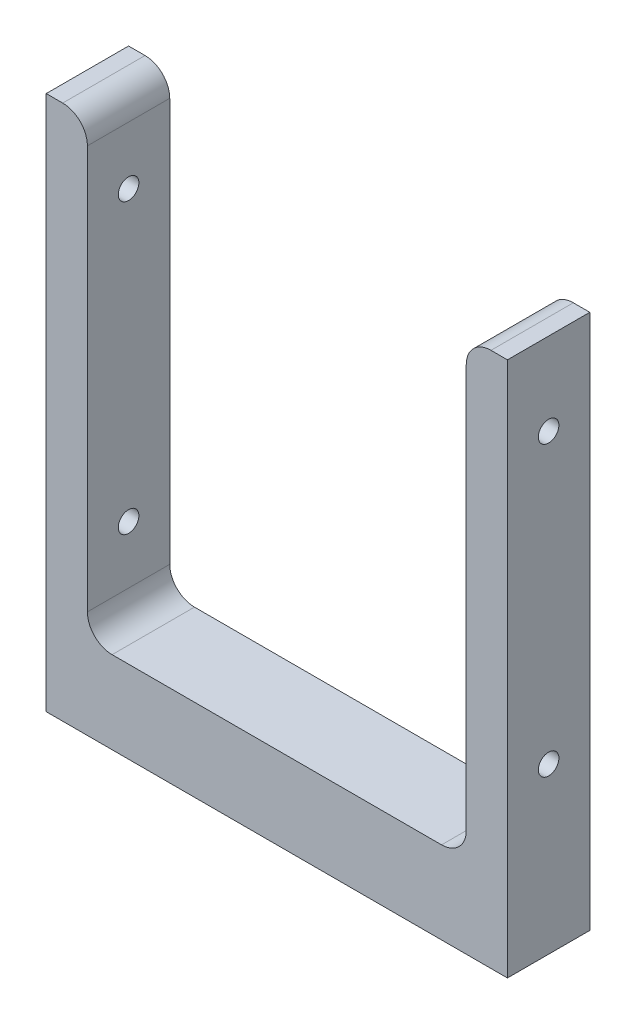
ISO-10303-21;
HEADER;
FILE_DESCRIPTION(('STEP AP214'),'2;1');
FILE_NAME('part.step','',(''),(''),'','','');
FILE_SCHEMA(('AUTOMOTIVE_DESIGN { 1 0 10303 214 1 1 1 1 }'));
ENDSEC;
DATA;
#1=APPLICATION_CONTEXT('core data for automotive mechanical design processes');
#2=APPLICATION_PROTOCOL_DEFINITION('international standard','automotive_design',2000,#1);
#3=PRODUCT_CONTEXT('',#1,'mechanical');
#4=PRODUCT('Part','Part','',(#3));
#5=PRODUCT_RELATED_PRODUCT_CATEGORY('part','',(#4));
#6=PRODUCT_DEFINITION_FORMATION('','',#4);
#7=PRODUCT_DEFINITION_CONTEXT('part definition',#1,'design');
#8=PRODUCT_DEFINITION('design','',#6,#7);
#9=PRODUCT_DEFINITION_SHAPE('','',#8);
#10=(LENGTH_UNIT() NAMED_UNIT(*) SI_UNIT(.MILLI.,.METRE.));
#11=(NAMED_UNIT(*) PLANE_ANGLE_UNIT() SI_UNIT($,.RADIAN.));
#12=(NAMED_UNIT(*) SI_UNIT($,.STERADIAN.) SOLID_ANGLE_UNIT());
#13=UNCERTAINTY_MEASURE_WITH_UNIT(LENGTH_MEASURE(1.E-05),#10,'distance_accuracy_value','');
#14=(GEOMETRIC_REPRESENTATION_CONTEXT(3) GLOBAL_UNCERTAINTY_ASSIGNED_CONTEXT((#13)) GLOBAL_UNIT_ASSIGNED_CONTEXT((#10,
#11,#12)) REPRESENTATION_CONTEXT('',''));
#15=CARTESIAN_POINT('',(0.,0.,0.));
#16=DIRECTION('',(0.,0.,1.));
#17=DIRECTION('',(1.,0.,0.));
#18=AXIS2_PLACEMENT_3D('',#15,#16,#17);
#19=CARTESIAN_POINT('',(28.,32.5,10.));
#20=DIRECTION('',(-1.,0.,0.));
#21=DIRECTION('',(0.,0.,1.));
#22=AXIS2_PLACEMENT_3D('',#19,#20,#21);
#23=PLANE('',#22);
#24=CARTESIAN_POINT('',(28.,22.5,5.00000000000001));
#25=DIRECTION('',(1.,0.,0.));
#26=DIRECTION('',(0.,0.,-1.));
#27=AXIS2_PLACEMENT_3D('',#24,#25,#26);
#28=CIRCLE('',#27,1.24999999999999);
#29=CARTESIAN_POINT('',(28.,22.5,3.75000000000002));
#30=VERTEX_POINT('',#29);
#31=EDGE_CURVE('E269',#30,#30,#28,.T.);
#32=ORIENTED_EDGE('',*,*,#31,.F.);
#33=EDGE_LOOP('',(#32));
#34=FACE_BOUND('',#33,.T.);
#35=CARTESIAN_POINT('',(28.,-12.5,5.00000000000001));
#36=DIRECTION('',(1.,0.,0.));
#37=DIRECTION('',(0.,0.,-1.));
#38=AXIS2_PLACEMENT_3D('',#35,#36,#37);
#39=CIRCLE('',#38,1.24999999999999);
#40=CARTESIAN_POINT('',(28.,-12.5,3.75000000000002));
#41=VERTEX_POINT('',#40);
#42=EDGE_CURVE('E257',#41,#41,#39,.T.);
#43=ORIENTED_EDGE('',*,*,#42,.F.);
#44=EDGE_LOOP('',(#43));
#45=FACE_BOUND('',#44,.T.);
#46=DIRECTION('',(0.,1.,0.));
#47=VECTOR('',#46,1.);
#48=CARTESIAN_POINT('',(28.,32.5,0.));
#49=LINE('',#48,#47);
#50=CARTESIAN_POINT('',(28.,-32.5,0.));
#51=VERTEX_POINT('',#50);
#52=CARTESIAN_POINT('',(28.,32.5,0.));
#53=VERTEX_POINT('',#52);
#54=EDGE_CURVE('E150',#51,#53,#49,.T.);
#55=ORIENTED_EDGE('',*,*,#54,.T.);
#56=DIRECTION('',(0.,0.,-1.));
#57=VECTOR('',#56,1.);
#58=CARTESIAN_POINT('',(28.,32.5,10.));
#59=LINE('',#58,#57);
#60=CARTESIAN_POINT('',(28.,32.5,10.));
#61=VERTEX_POINT('',#60);
#62=EDGE_CURVE('E132',#61,#53,#59,.T.);
#63=ORIENTED_EDGE('',*,*,#62,.F.);
#64=DIRECTION('',(0.,1.,0.));
#65=VECTOR('',#64,1.);
#66=CARTESIAN_POINT('',(28.,32.5,10.));
#67=LINE('',#66,#65);
#68=CARTESIAN_POINT('',(28.,-32.5,10.));
#69=VERTEX_POINT('',#68);
#70=EDGE_CURVE('E138',#69,#61,#67,.T.);
#71=ORIENTED_EDGE('',*,*,#70,.F.);
#72=DIRECTION('',(0.,0.,-1.));
#73=VECTOR('',#72,1.);
#74=CARTESIAN_POINT('',(28.,-32.5,10.));
#75=LINE('',#74,#73);
#76=EDGE_CURVE('E217',#69,#51,#75,.T.);
#77=ORIENTED_EDGE('',*,*,#76,.T.);
#78=EDGE_LOOP('',(#55,#63,#71,#77));
#79=FACE_BOUND('',#78,.T.);
#80=ADVANCED_FACE('F37',(#34,#45,#79),#23,.F.);
#81=CARTESIAN_POINT('',(28.,32.5,10.));
#82=DIRECTION('',(0.,-1.,0.));
#83=DIRECTION('',(0.,0.,-1.));
#84=AXIS2_PLACEMENT_3D('',#81,#82,#83);
#85=PLANE('',#84);
#86=DIRECTION('',(-1.,0.,0.));
#87=VECTOR('',#86,1.);
#88=CARTESIAN_POINT('',(28.,32.5,0.));
#89=LINE('',#88,#87);
#90=CARTESIAN_POINT('',(26.,32.5,0.));
#91=VERTEX_POINT('',#90);
#92=EDGE_CURVE('E219',#53,#91,#89,.T.);
#93=ORIENTED_EDGE('',*,*,#92,.T.);
#94=DIRECTION('',(0.,0.,-1.));
#95=VECTOR('',#94,1.);
#96=CARTESIAN_POINT('',(26.,32.5,10.));
#97=LINE('',#96,#95);
#98=CARTESIAN_POINT('',(26.,32.5,10.));
#99=VERTEX_POINT('',#98);
#100=EDGE_CURVE('E135',#91,#99,#97,.F.);
#101=ORIENTED_EDGE('',*,*,#100,.T.);
#102=DIRECTION('',(-1.,0.,0.));
#103=VECTOR('',#102,1.);
#104=CARTESIAN_POINT('',(28.,32.5,10.));
#105=LINE('',#104,#103);
#106=EDGE_CURVE('E127',#61,#99,#105,.T.);
#107=ORIENTED_EDGE('',*,*,#106,.F.);
#108=ORIENTED_EDGE('',*,*,#62,.T.);
#109=EDGE_LOOP('',(#93,#101,#107,#108));
#110=FACE_BOUND('',#109,.T.);
#111=ADVANCED_FACE('F130',(#110),#85,.F.);
#112=CARTESIAN_POINT('',(23.,32.5,10.));
#113=DIRECTION('',(1.,0.,0.));
#114=DIRECTION('',(0.,1.,0.));
#115=AXIS2_PLACEMENT_3D('',#112,#113,#114);
#116=PLANE('',#115);
#117=CARTESIAN_POINT('',(23.,22.5,5.00000000000001));
#118=DIRECTION('',(1.,0.,0.));
#119=DIRECTION('',(0.,1.,0.));
#120=AXIS2_PLACEMENT_3D('',#117,#118,#119);
#121=CIRCLE('',#120,1.24999999999999);
#122=CARTESIAN_POINT('',(23.,23.75,5.00000000000001));
#123=VERTEX_POINT('',#122);
#124=EDGE_CURVE('E260',#123,#123,#121,.T.);
#125=ORIENTED_EDGE('',*,*,#124,.T.);
#126=EDGE_LOOP('',(#125));
#127=FACE_BOUND('',#126,.T.);
#128=CARTESIAN_POINT('',(23.,-12.5,5.00000000000001));
#129=DIRECTION('',(1.,0.,0.));
#130=DIRECTION('',(0.,1.,0.));
#131=AXIS2_PLACEMENT_3D('',#128,#129,#130);
#132=CIRCLE('',#131,1.24999999999999);
#133=CARTESIAN_POINT('',(23.,-11.25,5.00000000000001));
#134=VERTEX_POINT('',#133);
#135=EDGE_CURVE('E220',#134,#134,#132,.T.);
#136=ORIENTED_EDGE('',*,*,#135,.T.);
#137=EDGE_LOOP('',(#136));
#138=FACE_BOUND('',#137,.T.);
#139=DIRECTION('',(0.,-1.,0.));
#140=VECTOR('',#139,1.);
#141=CARTESIAN_POINT('',(23.,32.5,10.));
#142=LINE('',#141,#140);
#143=CARTESIAN_POINT('',(23.,29.5,10.));
#144=VERTEX_POINT('',#143);
#145=CARTESIAN_POINT('',(23.,-19.5,10.));
#146=VERTEX_POINT('',#145);
#147=EDGE_CURVE('E137',#144,#146,#142,.T.);
#148=ORIENTED_EDGE('',*,*,#147,.F.);
#149=DIRECTION('',(0.,0.,-1.));
#150=VECTOR('',#149,1.);
#151=CARTESIAN_POINT('',(23.,29.5,10.));
#152=LINE('',#151,#150);
#153=CARTESIAN_POINT('',(23.,29.5,0.));
#154=VERTEX_POINT('',#153);
#155=EDGE_CURVE('E154',#144,#154,#152,.T.);
#156=ORIENTED_EDGE('',*,*,#155,.T.);
#157=DIRECTION('',(0.,-1.,0.));
#158=VECTOR('',#157,1.);
#159=CARTESIAN_POINT('',(23.,32.5,0.));
#160=LINE('',#159,#158);
#161=CARTESIAN_POINT('',(23.,-19.5,0.));
#162=VERTEX_POINT('',#161);
#163=EDGE_CURVE('E202',#154,#162,#160,.T.);
#164=ORIENTED_EDGE('',*,*,#163,.T.);
#165=DIRECTION('',(0.,0.,-1.));
#166=VECTOR('',#165,1.);
#167=CARTESIAN_POINT('',(23.,-19.5,10.));
#168=LINE('',#167,#166);
#169=EDGE_CURVE('E151',#162,#146,#168,.F.);
#170=ORIENTED_EDGE('',*,*,#169,.T.);
#171=EDGE_LOOP('',(#148,#156,#164,#170));
#172=FACE_BOUND('',#171,.T.);
#173=ADVANCED_FACE('F246',(#127,#138,#172),#116,.F.);
#174=CARTESIAN_POINT('',(-23.,-22.5,10.));
#175=DIRECTION('',(0.,-1.,0.));
#176=DIRECTION('',(0.,0.,-1.));
#177=AXIS2_PLACEMENT_3D('',#174,#175,#176);
#178=PLANE('',#177);
#179=DIRECTION('',(-1.,0.,0.));
#180=VECTOR('',#179,1.);
#181=CARTESIAN_POINT('',(-23.,-22.5,10.));
#182=LINE('',#181,#180);
#183=CARTESIAN_POINT('',(20.,-22.5,10.));
#184=VERTEX_POINT('',#183);
#185=CARTESIAN_POINT('',(-20.,-22.5,10.));
#186=VERTEX_POINT('',#185);
#187=EDGE_CURVE('E206',#184,#186,#182,.T.);
#188=ORIENTED_EDGE('',*,*,#187,.F.);
#189=DIRECTION('',(0.,0.,-1.));
#190=VECTOR('',#189,1.);
#191=CARTESIAN_POINT('',(20.,-22.5,0.));
#192=LINE('',#191,#190);
#193=CARTESIAN_POINT('',(20.,-22.5,0.));
#194=VERTEX_POINT('',#193);
#195=EDGE_CURVE('E180',#184,#194,#192,.T.);
#196=ORIENTED_EDGE('',*,*,#195,.T.);
#197=DIRECTION('',(-1.,0.,0.));
#198=VECTOR('',#197,1.);
#199=CARTESIAN_POINT('',(-23.,-22.5,0.));
#200=LINE('',#199,#198);
#201=CARTESIAN_POINT('',(-20.,-22.5,0.));
#202=VERTEX_POINT('',#201);
#203=EDGE_CURVE('E192',#194,#202,#200,.T.);
#204=ORIENTED_EDGE('',*,*,#203,.T.);
#205=DIRECTION('',(0.,0.,-1.));
#206=VECTOR('',#205,1.);
#207=CARTESIAN_POINT('',(-20.,-22.5,10.));
#208=LINE('',#207,#206);
#209=EDGE_CURVE('E178',#202,#186,#208,.F.);
#210=ORIENTED_EDGE('',*,*,#209,.T.);
#211=EDGE_LOOP('',(#188,#196,#204,#210));
#212=FACE_BOUND('',#211,.T.);
#213=ADVANCED_FACE('F199',(#212),#178,.F.);
#214=CARTESIAN_POINT('',(-23.,32.5,10.));
#215=DIRECTION('',(-1.,0.,0.));
#216=DIRECTION('',(0.,-1.,0.));
#217=AXIS2_PLACEMENT_3D('',#214,#215,#216);
#218=PLANE('',#217);
#219=CARTESIAN_POINT('',(-23.,22.5,5.00000000000001));
#220=DIRECTION('',(-1.,0.,0.));
#221=DIRECTION('',(0.,-1.,0.));
#222=AXIS2_PLACEMENT_3D('',#219,#220,#221);
#223=CIRCLE('',#222,1.24999999999999);
#224=CARTESIAN_POINT('',(-23.,21.25,5.00000000000001));
#225=VERTEX_POINT('',#224);
#226=EDGE_CURVE('E263',#225,#225,#223,.T.);
#227=ORIENTED_EDGE('',*,*,#226,.T.);
#228=EDGE_LOOP('',(#227));
#229=FACE_BOUND('',#228,.T.);
#230=CARTESIAN_POINT('',(-23.,-12.5,5.00000000000001));
#231=DIRECTION('',(-1.,0.,0.));
#232=DIRECTION('',(0.,-1.,0.));
#233=AXIS2_PLACEMENT_3D('',#230,#231,#232);
#234=CIRCLE('',#233,1.24999999999999);
#235=CARTESIAN_POINT('',(-23.,-13.75,5.00000000000001));
#236=VERTEX_POINT('',#235);
#237=EDGE_CURVE('E251',#236,#236,#234,.T.);
#238=ORIENTED_EDGE('',*,*,#237,.T.);
#239=EDGE_LOOP('',(#238));
#240=FACE_BOUND('',#239,.T.);
#241=DIRECTION('',(0.,1.,0.));
#242=VECTOR('',#241,1.);
#243=CARTESIAN_POINT('',(-23.,32.5,0.));
#244=LINE('',#243,#242);
#245=CARTESIAN_POINT('',(-23.,-19.5,0.));
#246=VERTEX_POINT('',#245);
#247=CARTESIAN_POINT('',(-23.,29.5,0.));
#248=VERTEX_POINT('',#247);
#249=EDGE_CURVE('E193',#246,#248,#244,.T.);
#250=ORIENTED_EDGE('',*,*,#249,.T.);
#251=DIRECTION('',(0.,0.,-1.));
#252=VECTOR('',#251,1.);
#253=CARTESIAN_POINT('',(-23.,29.5,10.));
#254=LINE('',#253,#252);
#255=CARTESIAN_POINT('',(-23.,29.5,10.));
#256=VERTEX_POINT('',#255);
#257=EDGE_CURVE('E60',#248,#256,#254,.F.);
#258=ORIENTED_EDGE('',*,*,#257,.T.);
#259=DIRECTION('',(0.,1.,0.));
#260=VECTOR('',#259,1.);
#261=CARTESIAN_POINT('',(-23.,32.5,10.));
#262=LINE('',#261,#260);
#263=CARTESIAN_POINT('',(-23.,-19.5,10.));
#264=VERTEX_POINT('',#263);
#265=EDGE_CURVE('E205',#264,#256,#262,.T.);
#266=ORIENTED_EDGE('',*,*,#265,.F.);
#267=DIRECTION('',(0.,0.,-1.));
#268=VECTOR('',#267,1.);
#269=CARTESIAN_POINT('',(-23.,-19.5,0.));
#270=LINE('',#269,#268);
#271=EDGE_CURVE('E174',#264,#246,#270,.T.);
#272=ORIENTED_EDGE('',*,*,#271,.T.);
#273=EDGE_LOOP('',(#250,#258,#266,#272));
#274=FACE_BOUND('',#273,.T.);
#275=ADVANCED_FACE('F207',(#229,#240,#274),#218,.F.);
#276=CARTESIAN_POINT('',(-28.,32.5,10.));
#277=DIRECTION('',(0.,-1.,0.));
#278=DIRECTION('',(0.,0.,-1.));
#279=AXIS2_PLACEMENT_3D('',#276,#277,#278);
#280=PLANE('',#279);
#281=DIRECTION('',(-1.,0.,0.));
#282=VECTOR('',#281,1.);
#283=CARTESIAN_POINT('',(-28.,32.5,10.));
#284=LINE('',#283,#282);
#285=CARTESIAN_POINT('',(-26.,32.5,10.));
#286=VERTEX_POINT('',#285);
#287=CARTESIAN_POINT('',(-28.,32.5,10.));
#288=VERTEX_POINT('',#287);
#289=EDGE_CURVE('E208',#286,#288,#284,.T.);
#290=ORIENTED_EDGE('',*,*,#289,.F.);
#291=DIRECTION('',(0.,0.,-1.));
#292=VECTOR('',#291,1.);
#293=CARTESIAN_POINT('',(-26.,32.5,10.));
#294=LINE('',#293,#292);
#295=CARTESIAN_POINT('',(-26.,32.5,0.));
#296=VERTEX_POINT('',#295);
#297=EDGE_CURVE('E171',#286,#296,#294,.T.);
#298=ORIENTED_EDGE('',*,*,#297,.T.);
#299=DIRECTION('',(-1.,0.,0.));
#300=VECTOR('',#299,1.);
#301=CARTESIAN_POINT('',(-28.,32.5,0.));
#302=LINE('',#301,#300);
#303=CARTESIAN_POINT('',(-28.,32.5,0.));
#304=VERTEX_POINT('',#303);
#305=EDGE_CURVE('E225',#296,#304,#302,.T.);
#306=ORIENTED_EDGE('',*,*,#305,.T.);
#307=DIRECTION('',(0.,0.,-1.));
#308=VECTOR('',#307,1.);
#309=CARTESIAN_POINT('',(-28.,32.5,10.));
#310=LINE('',#309,#308);
#311=EDGE_CURVE('E152',#288,#304,#310,.T.);
#312=ORIENTED_EDGE('',*,*,#311,.F.);
#313=EDGE_LOOP('',(#290,#298,#306,#312));
#314=FACE_BOUND('',#313,.T.);
#315=ADVANCED_FACE('F330',(#314),#280,.F.);
#316=CARTESIAN_POINT('',(-28.,32.5,10.));
#317=DIRECTION('',(1.,0.,0.));
#318=DIRECTION('',(0.,0.,-1.));
#319=AXIS2_PLACEMENT_3D('',#316,#317,#318);
#320=PLANE('',#319);
#321=CARTESIAN_POINT('',(-28.,22.5,5.00000000000001));
#322=DIRECTION('',(1.,0.,0.));
#323=DIRECTION('',(0.,0.,-1.));
#324=AXIS2_PLACEMENT_3D('',#321,#322,#323);
#325=CIRCLE('',#324,1.24999999999999);
#326=CARTESIAN_POINT('',(-28.,22.5,3.75000000000002));
#327=VERTEX_POINT('',#326);
#328=EDGE_CURVE('E266',#327,#327,#325,.T.);
#329=ORIENTED_EDGE('',*,*,#328,.T.);
#330=EDGE_LOOP('',(#329));
#331=FACE_BOUND('',#330,.T.);
#332=CARTESIAN_POINT('',(-28.,-12.5,5.00000000000001));
#333=DIRECTION('',(1.,0.,0.));
#334=DIRECTION('',(0.,0.,-1.));
#335=AXIS2_PLACEMENT_3D('',#332,#333,#334);
#336=CIRCLE('',#335,1.24999999999999);
#337=CARTESIAN_POINT('',(-28.,-12.5,3.75000000000002));
#338=VERTEX_POINT('',#337);
#339=EDGE_CURVE('E254',#338,#338,#336,.T.);
#340=ORIENTED_EDGE('',*,*,#339,.T.);
#341=EDGE_LOOP('',(#340));
#342=FACE_BOUND('',#341,.T.);
#343=DIRECTION('',(0.,-1.,0.));
#344=VECTOR('',#343,1.);
#345=CARTESIAN_POINT('',(-28.,32.5,0.));
#346=LINE('',#345,#344);
#347=CARTESIAN_POINT('',(-28.,-32.5,0.));
#348=VERTEX_POINT('',#347);
#349=EDGE_CURVE('E227',#304,#348,#346,.T.);
#350=ORIENTED_EDGE('',*,*,#349,.T.);
#351=DIRECTION('',(0.,0.,-1.));
#352=VECTOR('',#351,1.);
#353=CARTESIAN_POINT('',(-28.,-32.5,10.));
#354=LINE('',#353,#352);
#355=CARTESIAN_POINT('',(-28.,-32.5,10.));
#356=VERTEX_POINT('',#355);
#357=EDGE_CURVE('E157',#356,#348,#354,.T.);
#358=ORIENTED_EDGE('',*,*,#357,.F.);
#359=DIRECTION('',(0.,-1.,0.));
#360=VECTOR('',#359,1.);
#361=CARTESIAN_POINT('',(-28.,32.5,10.));
#362=LINE('',#361,#360);
#363=EDGE_CURVE('E210',#288,#356,#362,.T.);
#364=ORIENTED_EDGE('',*,*,#363,.F.);
#365=ORIENTED_EDGE('',*,*,#311,.T.);
#366=EDGE_LOOP('',(#350,#358,#364,#365));
#367=FACE_BOUND('',#366,.T.);
#368=ADVANCED_FACE('F327',(#331,#342,#367),#320,.F.);
#369=CARTESIAN_POINT('',(-28.,-32.5,10.));
#370=DIRECTION('',(0.,1.,0.));
#371=DIRECTION('',(0.,0.,1.));
#372=AXIS2_PLACEMENT_3D('',#369,#370,#371);
#373=PLANE('',#372);
#374=DIRECTION('',(1.,0.,0.));
#375=VECTOR('',#374,1.);
#376=CARTESIAN_POINT('',(-28.,-32.5,0.));
#377=LINE('',#376,#375);
#378=EDGE_CURVE('E147',#348,#51,#377,.T.);
#379=ORIENTED_EDGE('',*,*,#378,.T.);
#380=ORIENTED_EDGE('',*,*,#76,.F.);
#381=DIRECTION('',(1.,0.,0.));
#382=VECTOR('',#381,1.);
#383=CARTESIAN_POINT('',(-28.,-32.5,10.));
#384=LINE('',#383,#382);
#385=EDGE_CURVE('E143',#356,#69,#384,.T.);
#386=ORIENTED_EDGE('',*,*,#385,.F.);
#387=ORIENTED_EDGE('',*,*,#357,.T.);
#388=EDGE_LOOP('',(#379,#380,#386,#387));
#389=FACE_BOUND('',#388,.T.);
#390=ADVANCED_FACE('F234',(#389),#373,.F.);
#391=CARTESIAN_POINT('',(0.,0.,10.));
#392=DIRECTION('',(0.,0.,1.));
#393=DIRECTION('',(1.,0.,0.));
#394=AXIS2_PLACEMENT_3D('',#391,#392,#393);
#395=PLANE('',#394);
#396=ORIENTED_EDGE('',*,*,#106,.T.);
#397=CARTESIAN_POINT('',(26.,29.5,10.));
#398=DIRECTION('',(0.,0.,1.));
#399=DIRECTION('',(1.,0.,0.));
#400=AXIS2_PLACEMENT_3D('',#397,#398,#399);
#401=CIRCLE('',#400,3.);
#402=EDGE_CURVE('E169',#99,#144,#401,.T.);
#403=ORIENTED_EDGE('',*,*,#402,.T.);
#404=ORIENTED_EDGE('',*,*,#147,.T.);
#405=CARTESIAN_POINT('',(20.,-19.5,10.));
#406=DIRECTION('',(0.,0.,1.));
#407=DIRECTION('',(1.,0.,0.));
#408=AXIS2_PLACEMENT_3D('',#405,#406,#407);
#409=CIRCLE('',#408,3.);
#410=EDGE_CURVE('E185',#146,#184,#409,.F.);
#411=ORIENTED_EDGE('',*,*,#410,.T.);
#412=ORIENTED_EDGE('',*,*,#187,.T.);
#413=CARTESIAN_POINT('',(-20.,-19.5,10.));
#414=DIRECTION('',(0.,0.,1.));
#415=DIRECTION('',(1.,0.,0.));
#416=AXIS2_PLACEMENT_3D('',#413,#414,#415);
#417=CIRCLE('',#416,3.);
#418=EDGE_CURVE('E11',#186,#264,#417,.F.);
#419=ORIENTED_EDGE('',*,*,#418,.T.);
#420=ORIENTED_EDGE('',*,*,#265,.T.);
#421=CARTESIAN_POINT('',(-26.,29.5,10.));
#422=DIRECTION('',(0.,0.,1.));
#423=DIRECTION('',(1.,0.,0.));
#424=AXIS2_PLACEMENT_3D('',#421,#422,#423);
#425=CIRCLE('',#424,3.);
#426=EDGE_CURVE('E52',#256,#286,#425,.T.);
#427=ORIENTED_EDGE('',*,*,#426,.T.);
#428=ORIENTED_EDGE('',*,*,#289,.T.);
#429=ORIENTED_EDGE('',*,*,#363,.T.);
#430=ORIENTED_EDGE('',*,*,#385,.T.);
#431=ORIENTED_EDGE('',*,*,#70,.T.);
#432=EDGE_LOOP('',(#396,#403,#404,#411,#412,#419,#420,#427,#428,#429,#430,#431));
#433=FACE_BOUND('',#432,.T.);
#434=ADVANCED_FACE('F141',(#433),#395,.T.);
#435=CARTESIAN_POINT('',(0.,0.,0.));
#436=DIRECTION('',(0.,0.,1.));
#437=DIRECTION('',(1.,0.,0.));
#438=AXIS2_PLACEMENT_3D('',#435,#436,#437);
#439=PLANE('',#438);
#440=ORIENTED_EDGE('',*,*,#163,.F.);
#441=CARTESIAN_POINT('',(26.,29.5,0.));
#442=DIRECTION('',(0.,0.,1.));
#443=DIRECTION('',(1.,0.,0.));
#444=AXIS2_PLACEMENT_3D('',#441,#442,#443);
#445=CIRCLE('',#444,3.);
#446=EDGE_CURVE('E165',#154,#91,#445,.F.);
#447=ORIENTED_EDGE('',*,*,#446,.T.);
#448=ORIENTED_EDGE('',*,*,#92,.F.);
#449=ORIENTED_EDGE('',*,*,#54,.F.);
#450=ORIENTED_EDGE('',*,*,#378,.F.);
#451=ORIENTED_EDGE('',*,*,#349,.F.);
#452=ORIENTED_EDGE('',*,*,#305,.F.);
#453=CARTESIAN_POINT('',(-26.,29.5,0.));
#454=DIRECTION('',(0.,0.,1.));
#455=DIRECTION('',(1.,0.,0.));
#456=AXIS2_PLACEMENT_3D('',#453,#454,#455);
#457=CIRCLE('',#456,3.);
#458=EDGE_CURVE('E163',#296,#248,#457,.F.);
#459=ORIENTED_EDGE('',*,*,#458,.T.);
#460=ORIENTED_EDGE('',*,*,#249,.F.);
#461=CARTESIAN_POINT('',(-20.,-19.5,0.));
#462=DIRECTION('',(0.,0.,1.));
#463=DIRECTION('',(1.,0.,0.));
#464=AXIS2_PLACEMENT_3D('',#461,#462,#463);
#465=CIRCLE('',#464,3.);
#466=EDGE_CURVE('E45',#246,#202,#465,.T.);
#467=ORIENTED_EDGE('',*,*,#466,.T.);
#468=ORIENTED_EDGE('',*,*,#203,.F.);
#469=CARTESIAN_POINT('',(20.,-19.5,0.));
#470=DIRECTION('',(0.,0.,1.));
#471=DIRECTION('',(1.,0.,0.));
#472=AXIS2_PLACEMENT_3D('',#469,#470,#471);
#473=CIRCLE('',#472,3.);
#474=EDGE_CURVE('E183',#194,#162,#473,.T.);
#475=ORIENTED_EDGE('',*,*,#474,.T.);
#476=EDGE_LOOP('',(#440,#447,#448,#449,#450,#451,#452,#459,#460,#467,#468,#475));
#477=FACE_BOUND('',#476,.T.);
#478=ADVANCED_FACE('F191',(#477),#439,.F.);
#479=CARTESIAN_POINT('',(26.,29.5,10.));
#480=DIRECTION('',(0.,0.,-1.));
#481=DIRECTION('',(-1.,0.,0.));
#482=AXIS2_PLACEMENT_3D('',#479,#480,#481);
#483=CYLINDRICAL_SURFACE('',#482,3.);
#484=ORIENTED_EDGE('',*,*,#402,.F.);
#485=ORIENTED_EDGE('',*,*,#100,.F.);
#486=ORIENTED_EDGE('',*,*,#446,.F.);
#487=ORIENTED_EDGE('',*,*,#155,.F.);
#488=EDGE_LOOP('',(#484,#485,#486,#487));
#489=FACE_BOUND('',#488,.T.);
#490=ADVANCED_FACE('F240',(#489),#483,.T.);
#491=CARTESIAN_POINT('',(-26.,29.5,10.));
#492=DIRECTION('',(0.,0.,-1.));
#493=DIRECTION('',(-1.,0.,0.));
#494=AXIS2_PLACEMENT_3D('',#491,#492,#493);
#495=CYLINDRICAL_SURFACE('',#494,3.);
#496=ORIENTED_EDGE('',*,*,#426,.F.);
#497=ORIENTED_EDGE('',*,*,#257,.F.);
#498=ORIENTED_EDGE('',*,*,#458,.F.);
#499=ORIENTED_EDGE('',*,*,#297,.F.);
#500=EDGE_LOOP('',(#496,#497,#498,#499));
#501=FACE_BOUND('',#500,.T.);
#502=ADVANCED_FACE('F302',(#501),#495,.T.);
#503=CARTESIAN_POINT('',(20.,-19.5,10.));
#504=DIRECTION('',(0.,0.,1.));
#505=DIRECTION('',(1.,0.,0.));
#506=AXIS2_PLACEMENT_3D('',#503,#504,#505);
#507=CYLINDRICAL_SURFACE('',#506,3.);
#508=ORIENTED_EDGE('',*,*,#410,.F.);
#509=ORIENTED_EDGE('',*,*,#169,.F.);
#510=ORIENTED_EDGE('',*,*,#474,.F.);
#511=ORIENTED_EDGE('',*,*,#195,.F.);
#512=EDGE_LOOP('',(#508,#509,#510,#511));
#513=FACE_BOUND('',#512,.T.);
#514=ADVANCED_FACE('F304',(#513),#507,.F.);
#515=CARTESIAN_POINT('',(-20.,-19.5,10.));
#516=DIRECTION('',(0.,0.,1.));
#517=DIRECTION('',(1.,0.,0.));
#518=AXIS2_PLACEMENT_3D('',#515,#516,#517);
#519=CYLINDRICAL_SURFACE('',#518,3.);
#520=ORIENTED_EDGE('',*,*,#418,.F.);
#521=ORIENTED_EDGE('',*,*,#209,.F.);
#522=ORIENTED_EDGE('',*,*,#466,.F.);
#523=ORIENTED_EDGE('',*,*,#271,.F.);
#524=EDGE_LOOP('',(#520,#521,#522,#523));
#525=FACE_BOUND('',#524,.T.);
#526=ADVANCED_FACE('F39',(#525),#519,.F.);
#527=CARTESIAN_POINT('',(28.,-12.5,5.00000000000001));
#528=DIRECTION('',(1.,0.,0.));
#529=DIRECTION('',(0.,0.,-1.));
#530=AXIS2_PLACEMENT_3D('',#527,#528,#529);
#531=CYLINDRICAL_SURFACE('',#530,1.24999999999999);
#532=ORIENTED_EDGE('',*,*,#339,.F.);
#533=EDGE_LOOP('',(#532));
#534=FACE_BOUND('',#533,.T.);
#535=ORIENTED_EDGE('',*,*,#237,.F.);
#536=EDGE_LOOP('',(#535));
#537=FACE_BOUND('',#536,.T.);
#538=ADVANCED_FACE('F285',(#534,#537),#531,.F.);
#539=ORIENTED_EDGE('',*,*,#42,.T.);
#540=EDGE_LOOP('',(#539));
#541=FACE_BOUND('',#540,.T.);
#542=ORIENTED_EDGE('',*,*,#135,.F.);
#543=EDGE_LOOP('',(#542));
#544=FACE_BOUND('',#543,.T.);
#545=ADVANCED_FACE('F281',(#541,#544),#531,.F.);
#546=CARTESIAN_POINT('',(28.,22.5,5.00000000000001));
#547=DIRECTION('',(1.,0.,0.));
#548=DIRECTION('',(0.,0.,-1.));
#549=AXIS2_PLACEMENT_3D('',#546,#547,#548);
#550=CYLINDRICAL_SURFACE('',#549,1.24999999999999);
#551=ORIENTED_EDGE('',*,*,#328,.F.);
#552=EDGE_LOOP('',(#551));
#553=FACE_BOUND('',#552,.T.);
#554=ORIENTED_EDGE('',*,*,#226,.F.);
#555=EDGE_LOOP('',(#554));
#556=FACE_BOUND('',#555,.T.);
#557=ADVANCED_FACE('F284',(#553,#556),#550,.F.);
#558=ORIENTED_EDGE('',*,*,#31,.T.);
#559=EDGE_LOOP('',(#558));
#560=FACE_BOUND('',#559,.T.);
#561=ORIENTED_EDGE('',*,*,#124,.F.);
#562=EDGE_LOOP('',(#561));
#563=FACE_BOUND('',#562,.T.);
#564=ADVANCED_FACE('F273',(#560,#563),#550,.F.);
#565=CLOSED_SHELL('',(#80,#111,#173,#213,#275,#315,#368,#390,#434,#478,#490,#502,#514,#526,#538,
#545,#557,#564));
#566=MANIFOLD_SOLID_BREP('B2',#565);
#567=ADVANCED_BREP_SHAPE_REPRESENTATION('',(#18,#566),#14);
#568=SHAPE_DEFINITION_REPRESENTATION(#9,#567);
ENDSEC;
END-ISO-10303-21;
